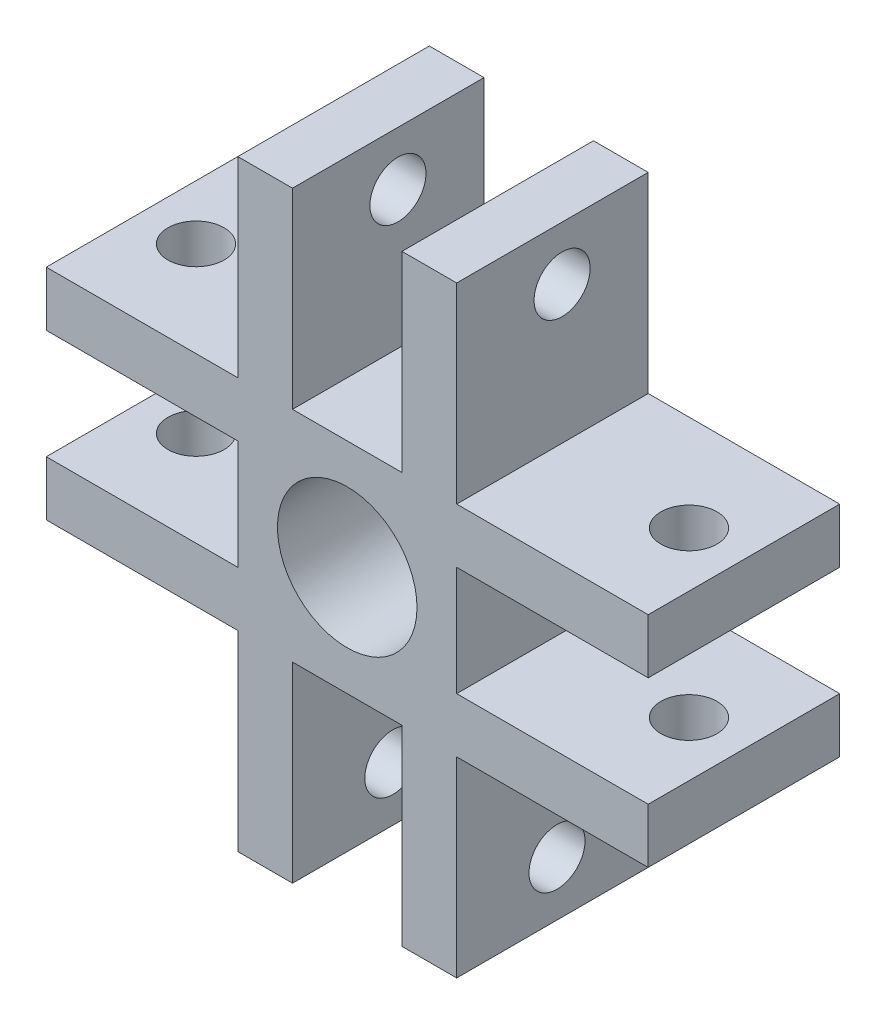
ISO-10303-21;
HEADER;
FILE_DESCRIPTION(('STEP AP214'),'2;1');
FILE_NAME('part.step','',(''),(''),'','','');
FILE_SCHEMA(('AUTOMOTIVE_DESIGN { 1 0 10303 214 1 1 1 1 }'));
ENDSEC;
DATA;
#1=APPLICATION_CONTEXT('core data for automotive mechanical design processes');
#2=APPLICATION_PROTOCOL_DEFINITION('international standard','automotive_design',2000,#1);
#3=PRODUCT_CONTEXT('',#1,'mechanical');
#4=PRODUCT('Part','Part','',(#3));
#5=PRODUCT_RELATED_PRODUCT_CATEGORY('part','',(#4));
#6=PRODUCT_DEFINITION_FORMATION('','',#4);
#7=PRODUCT_DEFINITION_CONTEXT('part definition',#1,'design');
#8=PRODUCT_DEFINITION('design','',#6,#7);
#9=PRODUCT_DEFINITION_SHAPE('','',#8);
#10=(LENGTH_UNIT() NAMED_UNIT(*) SI_UNIT(.MILLI.,.METRE.));
#11=(NAMED_UNIT(*) PLANE_ANGLE_UNIT() SI_UNIT($,.RADIAN.));
#12=(NAMED_UNIT(*) SI_UNIT($,.STERADIAN.) SOLID_ANGLE_UNIT());
#13=UNCERTAINTY_MEASURE_WITH_UNIT(LENGTH_MEASURE(1.E-05),#10,'distance_accuracy_value','');
#14=(GEOMETRIC_REPRESENTATION_CONTEXT(3) GLOBAL_UNCERTAINTY_ASSIGNED_CONTEXT((#13)) GLOBAL_UNIT_ASSIGNED_CONTEXT((#10,
#11,#12)) REPRESENTATION_CONTEXT('',''));
#15=CARTESIAN_POINT('',(0.,0.,0.));
#16=DIRECTION('',(0.,0.,1.));
#17=DIRECTION('',(1.,0.,0.));
#18=AXIS2_PLACEMENT_3D('',#15,#16,#17);
#19=CARTESIAN_POINT('',(11.,-11.,7.));
#20=DIRECTION('',(0.,0.,1.));
#21=DIRECTION('',(1.,0.,0.));
#22=AXIS2_PLACEMENT_3D('',#19,#20,#21);
#23=PLANE('',#22);
#24=CARTESIAN_POINT('',(0.,0.,7.));
#25=DIRECTION('',(0.,0.,1.));
#26=DIRECTION('',(1.,0.,0.));
#27=AXIS2_PLACEMENT_3D('',#24,#25,#26);
#28=CIRCLE('',#27,2.55);
#29=CARTESIAN_POINT('',(2.55,0.,7.));
#30=VERTEX_POINT('',#29);
#31=EDGE_CURVE('E247',#30,#30,#28,.T.);
#32=ORIENTED_EDGE('',*,*,#31,.F.);
#33=EDGE_LOOP('',(#32));
#34=FACE_BOUND('',#33,.T.);
#35=DIRECTION('',(-1.,0.,0.));
#36=VECTOR('',#35,1.);
#37=CARTESIAN_POINT('',(-0.933783745639004,-3.99999999999999,7.));
#38=LINE('',#37,#36);
#39=CARTESIAN_POINT('',(1.99999999999999,-4.00000000000001,7.));
#40=VERTEX_POINT('',#39);
#41=CARTESIAN_POINT('',(-2.00000000000001,-3.99999999999999,7.));
#42=VERTEX_POINT('',#41);
#43=EDGE_CURVE('E244',#40,#42,#38,.T.);
#44=ORIENTED_EDGE('',*,*,#43,.F.);
#45=DIRECTION('',(0.,-1.,0.));
#46=VECTOR('',#45,1.);
#47=CARTESIAN_POINT('',(1.99999999999991,-24.6504822813114,7.));
#48=LINE('',#47,#46);
#49=CARTESIAN_POINT('',(1.99999999999997,-11.,7.));
#50=VERTEX_POINT('',#49);
#51=EDGE_CURVE('E225',#40,#50,#48,.T.);
#52=ORIENTED_EDGE('',*,*,#51,.T.);
#53=DIRECTION('',(1.,0.,0.));
#54=VECTOR('',#53,1.);
#55=CARTESIAN_POINT('',(-11.,-11.,7.));
#56=LINE('',#55,#54);
#57=CARTESIAN_POINT('',(4.00000000000016,-11.,7.));
#58=VERTEX_POINT('',#57);
#59=EDGE_CURVE('E41',#50,#58,#56,.T.);
#60=ORIENTED_EDGE('',*,*,#59,.T.);
#61=DIRECTION('',(0.,-1.,0.));
#62=VECTOR('',#61,1.);
#63=CARTESIAN_POINT('',(4.00000000000016,-4.,7.));
#64=LINE('',#63,#62);
#65=CARTESIAN_POINT('',(4.00000000000016,-4.,7.));
#66=VERTEX_POINT('',#65);
#67=EDGE_CURVE('E337',#66,#58,#64,.T.);
#68=ORIENTED_EDGE('',*,*,#67,.F.);
#69=DIRECTION('',(-1.,0.,0.));
#70=VECTOR('',#69,1.);
#71=CARTESIAN_POINT('',(4.00000000000016,-4.,7.));
#72=LINE('',#71,#70);
#73=CARTESIAN_POINT('',(11.0000000000002,-4.,7.));
#74=VERTEX_POINT('',#73);
#75=EDGE_CURVE('E326',#74,#66,#72,.T.);
#76=ORIENTED_EDGE('',*,*,#75,.F.);
#77=DIRECTION('',(0.,1.,0.));
#78=VECTOR('',#77,1.);
#79=CARTESIAN_POINT('',(11.,11.,7.));
#80=LINE('',#79,#78);
#81=CARTESIAN_POINT('',(11.,-2.,7.));
#82=VERTEX_POINT('',#81);
#83=EDGE_CURVE('E408',#74,#82,#80,.T.);
#84=ORIENTED_EDGE('',*,*,#83,.T.);
#85=DIRECTION('',(1.,0.,0.));
#86=VECTOR('',#85,1.);
#87=CARTESIAN_POINT('',(-0.933783745639071,-2.,7.));
#88=LINE('',#87,#86);
#89=CARTESIAN_POINT('',(4.,-2.,7.));
#90=VERTEX_POINT('',#89);
#91=EDGE_CURVE('E57',#90,#82,#88,.T.);
#92=ORIENTED_EDGE('',*,*,#91,.F.);
#93=DIRECTION('',(0.,-1.,0.));
#94=VECTOR('',#93,1.);
#95=CARTESIAN_POINT('',(4.,-24.6504822813114,7.));
#96=LINE('',#95,#94);
#97=CARTESIAN_POINT('',(4.,2.,7.));
#98=VERTEX_POINT('',#97);
#99=EDGE_CURVE('E271',#98,#90,#96,.T.);
#100=ORIENTED_EDGE('',*,*,#99,.F.);
#101=DIRECTION('',(1.,0.,0.));
#102=VECTOR('',#101,1.);
#103=CARTESIAN_POINT('',(-0.933783745639071,2.,7.));
#104=LINE('',#103,#102);
#105=CARTESIAN_POINT('',(11.,2.,7.));
#106=VERTEX_POINT('',#105);
#107=EDGE_CURVE('E256',#98,#106,#104,.T.);
#108=ORIENTED_EDGE('',*,*,#107,.T.);
#109=CARTESIAN_POINT('',(11.,4.,7.));
#110=VERTEX_POINT('',#109);
#111=EDGE_CURVE('E412',#106,#110,#80,.T.);
#112=ORIENTED_EDGE('',*,*,#111,.T.);
#113=DIRECTION('',(1.,0.,0.));
#114=VECTOR('',#113,1.);
#115=CARTESIAN_POINT('',(4.,4.,7.));
#116=LINE('',#115,#114);
#117=CARTESIAN_POINT('',(4.,4.,7.));
#118=VERTEX_POINT('',#117);
#119=EDGE_CURVE('E374',#118,#110,#116,.T.);
#120=ORIENTED_EDGE('',*,*,#119,.F.);
#121=DIRECTION('',(0.,-1.,0.));
#122=VECTOR('',#121,1.);
#123=CARTESIAN_POINT('',(4.,11.,7.));
#124=LINE('',#123,#122);
#125=CARTESIAN_POINT('',(4.,11.,7.));
#126=VERTEX_POINT('',#125);
#127=EDGE_CURVE('E365',#126,#118,#124,.T.);
#128=ORIENTED_EDGE('',*,*,#127,.F.);
#129=DIRECTION('',(-1.,0.,0.));
#130=VECTOR('',#129,1.);
#131=CARTESIAN_POINT('',(-11.,11.,7.));
#132=LINE('',#131,#130);
#133=CARTESIAN_POINT('',(2.00000000000008,11.,7.));
#134=VERTEX_POINT('',#133);
#135=EDGE_CURVE('E413',#126,#134,#132,.T.);
#136=ORIENTED_EDGE('',*,*,#135,.T.);
#137=DIRECTION('',(0.,1.,0.));
#138=VECTOR('',#137,1.);
#139=CARTESIAN_POINT('',(1.99999999999974,-24.6504822813114,7.));
#140=LINE('',#139,#138);
#141=CARTESIAN_POINT('',(2.00000000000004,3.99999999999998,7.));
#142=VERTEX_POINT('',#141);
#143=EDGE_CURVE('E286',#142,#134,#140,.T.);
#144=ORIENTED_EDGE('',*,*,#143,.F.);
#145=DIRECTION('',(1.,0.,0.));
#146=VECTOR('',#145,1.);
#147=CARTESIAN_POINT('',(-0.933783745638779,4.00000000000001,7.));
#148=LINE('',#147,#146);
#149=CARTESIAN_POINT('',(-1.99999999999996,4.00000000000002,7.));
#150=VERTEX_POINT('',#149);
#151=EDGE_CURVE('E295',#150,#142,#148,.T.);
#152=ORIENTED_EDGE('',*,*,#151,.F.);
#153=DIRECTION('',(0.,1.,0.));
#154=VECTOR('',#153,1.);
#155=CARTESIAN_POINT('',(-2.00000000000026,-24.6504822813114,7.));
#156=LINE('',#155,#154);
#157=CARTESIAN_POINT('',(-1.99999999999992,11.,7.));
#158=VERTEX_POINT('',#157);
#159=EDGE_CURVE('E277',#150,#158,#156,.T.);
#160=ORIENTED_EDGE('',*,*,#159,.T.);
#161=CARTESIAN_POINT('',(-4.,11.,7.));
#162=VERTEX_POINT('',#161);
#163=EDGE_CURVE('E411',#158,#162,#132,.T.);
#164=ORIENTED_EDGE('',*,*,#163,.T.);
#165=DIRECTION('',(0.,1.,0.));
#166=VECTOR('',#165,1.);
#167=CARTESIAN_POINT('',(-4.,11.,7.));
#168=LINE('',#167,#166);
#169=CARTESIAN_POINT('',(-4.,4.,7.));
#170=VERTEX_POINT('',#169);
#171=EDGE_CURVE('E393',#170,#162,#168,.T.);
#172=ORIENTED_EDGE('',*,*,#171,.F.);
#173=DIRECTION('',(1.,0.,0.));
#174=VECTOR('',#173,1.);
#175=CARTESIAN_POINT('',(-11.,4.,7.));
#176=LINE('',#175,#174);
#177=CARTESIAN_POINT('',(-11.,4.,7.));
#178=VERTEX_POINT('',#177);
#179=EDGE_CURVE('E385',#178,#170,#176,.T.);
#180=ORIENTED_EDGE('',*,*,#179,.F.);
#181=DIRECTION('',(0.,-1.,0.));
#182=VECTOR('',#181,1.);
#183=CARTESIAN_POINT('',(-11.,11.,7.));
#184=LINE('',#183,#182);
#185=CARTESIAN_POINT('',(-11.,2.00000000000005,7.));
#186=VERTEX_POINT('',#185);
#187=EDGE_CURVE('E417',#178,#186,#184,.T.);
#188=ORIENTED_EDGE('',*,*,#187,.T.);
#189=DIRECTION('',(-1.,0.,0.));
#190=VECTOR('',#189,1.);
#191=CARTESIAN_POINT('',(-0.933783745638885,2.00000000000001,7.));
#192=LINE('',#191,#190);
#193=CARTESIAN_POINT('',(-3.99999999999999,2.00000000000003,7.));
#194=VERTEX_POINT('',#193);
#195=EDGE_CURVE('E311',#194,#186,#192,.T.);
#196=ORIENTED_EDGE('',*,*,#195,.F.);
#197=DIRECTION('',(0.,1.,0.));
#198=VECTOR('',#197,1.);
#199=CARTESIAN_POINT('',(-4.00000000000017,-24.6504822813114,7.));
#200=LINE('',#199,#198);
#201=CARTESIAN_POINT('',(-4.00000000000001,-1.99999999999997,7.));
#202=VERTEX_POINT('',#201);
#203=EDGE_CURVE('E320',#202,#194,#200,.T.);
#204=ORIENTED_EDGE('',*,*,#203,.F.);
#205=DIRECTION('',(-1.,0.,0.));
#206=VECTOR('',#205,1.);
#207=CARTESIAN_POINT('',(-0.933783745638913,-1.99999999999999,7.));
#208=LINE('',#207,#206);
#209=CARTESIAN_POINT('',(-11.,-1.99999999999995,7.));
#210=VERTEX_POINT('',#209);
#211=EDGE_CURVE('E301',#202,#210,#208,.T.);
#212=ORIENTED_EDGE('',*,*,#211,.T.);
#213=CARTESIAN_POINT('',(-10.9999999999998,-4.,7.));
#214=VERTEX_POINT('',#213);
#215=EDGE_CURVE('E416',#210,#214,#184,.T.);
#216=ORIENTED_EDGE('',*,*,#215,.T.);
#217=DIRECTION('',(-1.,0.,0.));
#218=VECTOR('',#217,1.);
#219=CARTESIAN_POINT('',(-10.9999999999998,-4.,7.));
#220=LINE('',#219,#218);
#221=CARTESIAN_POINT('',(-3.99999999999984,-4.,7.));
#222=VERTEX_POINT('',#221);
#223=EDGE_CURVE('E346',#222,#214,#220,.T.);
#224=ORIENTED_EDGE('',*,*,#223,.F.);
#225=DIRECTION('',(0.,1.,0.));
#226=VECTOR('',#225,1.);
#227=CARTESIAN_POINT('',(-3.99999999999984,-4.,7.));
#228=LINE('',#227,#226);
#229=CARTESIAN_POINT('',(-3.99999999999984,-11.,7.));
#230=VERTEX_POINT('',#229);
#231=EDGE_CURVE('E355',#230,#222,#228,.T.);
#232=ORIENTED_EDGE('',*,*,#231,.F.);
#233=CARTESIAN_POINT('',(-2.00000000000003,-11.,7.));
#234=VERTEX_POINT('',#233);
#235=EDGE_CURVE('E11',#230,#234,#56,.T.);
#236=ORIENTED_EDGE('',*,*,#235,.T.);
#237=DIRECTION('',(0.,-1.,0.));
#238=VECTOR('',#237,1.);
#239=CARTESIAN_POINT('',(-2.00000000000009,-24.6504822813114,7.));
#240=LINE('',#239,#238);
#241=EDGE_CURVE('E49',#42,#234,#240,.T.);
#242=ORIENTED_EDGE('',*,*,#241,.F.);
#243=EDGE_LOOP('',(#44,#52,#60,#68,#76,#84,#92,#100,#108,#112,#120,#128,#136,#144,#152,#160,
#164,#172,#180,#188,#196,#204,#212,#216,#224,#232,#236,#242));
#244=FACE_BOUND('',#243,.T.);
#245=ADVANCED_FACE('F32',(#34,#244),#23,.T.);
#246=CARTESIAN_POINT('',(11.,-11.,0.));
#247=DIRECTION('',(0.,0.,1.));
#248=DIRECTION('',(1.,0.,0.));
#249=AXIS2_PLACEMENT_3D('',#246,#247,#248);
#250=PLANE('',#249);
#251=CARTESIAN_POINT('',(0.,0.,0.));
#252=DIRECTION('',(0.,0.,1.));
#253=DIRECTION('',(1.,0.,0.));
#254=AXIS2_PLACEMENT_3D('',#251,#252,#253);
#255=CIRCLE('',#254,2.55);
#256=CARTESIAN_POINT('',(2.55,0.,0.));
#257=VERTEX_POINT('',#256);
#258=EDGE_CURVE('E252',#257,#257,#255,.T.);
#259=ORIENTED_EDGE('',*,*,#258,.T.);
#260=EDGE_LOOP('',(#259));
#261=FACE_BOUND('',#260,.T.);
#262=DIRECTION('',(0.,-1.,0.));
#263=VECTOR('',#262,1.);
#264=CARTESIAN_POINT('',(1.99999999999991,-24.6504822813114,0.));
#265=LINE('',#264,#263);
#266=CARTESIAN_POINT('',(1.99999999999999,-4.00000000000001,0.));
#267=VERTEX_POINT('',#266);
#268=CARTESIAN_POINT('',(1.99999999999997,-11.,0.));
#269=VERTEX_POINT('',#268);
#270=EDGE_CURVE('E222',#267,#269,#265,.T.);
#271=ORIENTED_EDGE('',*,*,#270,.F.);
#272=DIRECTION('',(-1.,0.,0.));
#273=VECTOR('',#272,1.);
#274=CARTESIAN_POINT('',(-0.933783745639004,-3.99999999999999,0.));
#275=LINE('',#274,#273);
#276=CARTESIAN_POINT('',(-2.00000000000001,-3.99999999999999,0.));
#277=VERTEX_POINT('',#276);
#278=EDGE_CURVE('E233',#267,#277,#275,.T.);
#279=ORIENTED_EDGE('',*,*,#278,.T.);
#280=DIRECTION('',(0.,-1.,0.));
#281=VECTOR('',#280,1.);
#282=CARTESIAN_POINT('',(-2.00000000000009,-24.6504822813114,0.));
#283=LINE('',#282,#281);
#284=CARTESIAN_POINT('',(-2.00000000000003,-11.,0.));
#285=VERTEX_POINT('',#284);
#286=EDGE_CURVE('E230',#277,#285,#283,.T.);
#287=ORIENTED_EDGE('',*,*,#286,.T.);
#288=DIRECTION('',(1.,0.,0.));
#289=VECTOR('',#288,1.);
#290=CARTESIAN_POINT('',(-11.,-11.,0.));
#291=LINE('',#290,#289);
#292=CARTESIAN_POINT('',(-3.99999999999984,-11.,0.));
#293=VERTEX_POINT('',#292);
#294=EDGE_CURVE('E431',#293,#285,#291,.T.);
#295=ORIENTED_EDGE('',*,*,#294,.F.);
#296=DIRECTION('',(0.,1.,0.));
#297=VECTOR('',#296,1.);
#298=CARTESIAN_POINT('',(-3.99999999999984,-4.,0.));
#299=LINE('',#298,#297);
#300=CARTESIAN_POINT('',(-3.99999999999984,-4.,0.));
#301=VERTEX_POINT('',#300);
#302=EDGE_CURVE('E354',#293,#301,#299,.T.);
#303=ORIENTED_EDGE('',*,*,#302,.T.);
#304=DIRECTION('',(-1.,0.,0.));
#305=VECTOR('',#304,1.);
#306=CARTESIAN_POINT('',(-10.9999999999998,-4.,0.));
#307=LINE('',#306,#305);
#308=CARTESIAN_POINT('',(-10.9999999999998,-4.,0.));
#309=VERTEX_POINT('',#308);
#310=EDGE_CURVE('E351',#301,#309,#307,.T.);
#311=ORIENTED_EDGE('',*,*,#310,.T.);
#312=DIRECTION('',(0.,-1.,0.));
#313=VECTOR('',#312,1.);
#314=CARTESIAN_POINT('',(-11.,11.,0.));
#315=LINE('',#314,#313);
#316=CARTESIAN_POINT('',(-11.,-1.99999999999995,0.));
#317=VERTEX_POINT('',#316);
#318=EDGE_CURVE('E427',#317,#309,#315,.T.);
#319=ORIENTED_EDGE('',*,*,#318,.F.);
#320=DIRECTION('',(-1.,0.,0.));
#321=VECTOR('',#320,1.);
#322=CARTESIAN_POINT('',(-0.933783745638913,-1.99999999999999,0.));
#323=LINE('',#322,#321);
#324=CARTESIAN_POINT('',(-4.00000000000001,-1.99999999999997,0.));
#325=VERTEX_POINT('',#324);
#326=EDGE_CURVE('E308',#325,#317,#323,.T.);
#327=ORIENTED_EDGE('',*,*,#326,.F.);
#328=DIRECTION('',(0.,1.,0.));
#329=VECTOR('',#328,1.);
#330=CARTESIAN_POINT('',(-4.00000000000017,-24.6504822813114,0.));
#331=LINE('',#330,#329);
#332=CARTESIAN_POINT('',(-3.99999999999999,2.00000000000003,0.));
#333=VERTEX_POINT('',#332);
#334=EDGE_CURVE('E310',#325,#333,#331,.T.);
#335=ORIENTED_EDGE('',*,*,#334,.T.);
#336=DIRECTION('',(-1.,0.,0.));
#337=VECTOR('',#336,1.);
#338=CARTESIAN_POINT('',(-0.933783745638885,2.00000000000001,0.));
#339=LINE('',#338,#337);
#340=CARTESIAN_POINT('',(-11.,2.00000000000005,0.));
#341=VERTEX_POINT('',#340);
#342=EDGE_CURVE('E314',#333,#341,#339,.T.);
#343=ORIENTED_EDGE('',*,*,#342,.T.);
#344=CARTESIAN_POINT('',(-11.,4.,0.));
#345=VERTEX_POINT('',#344);
#346=EDGE_CURVE('E428',#345,#341,#315,.T.);
#347=ORIENTED_EDGE('',*,*,#346,.F.);
#348=DIRECTION('',(1.,0.,0.));
#349=VECTOR('',#348,1.);
#350=CARTESIAN_POINT('',(-11.,4.,0.));
#351=LINE('',#350,#349);
#352=CARTESIAN_POINT('',(-4.,4.,0.));
#353=VERTEX_POINT('',#352);
#354=EDGE_CURVE('E389',#345,#353,#351,.T.);
#355=ORIENTED_EDGE('',*,*,#354,.T.);
#356=DIRECTION('',(0.,1.,0.));
#357=VECTOR('',#356,1.);
#358=CARTESIAN_POINT('',(-4.,11.,0.));
#359=LINE('',#358,#357);
#360=CARTESIAN_POINT('',(-4.,11.,0.));
#361=VERTEX_POINT('',#360);
#362=EDGE_CURVE('E392',#353,#361,#359,.T.);
#363=ORIENTED_EDGE('',*,*,#362,.T.);
#364=DIRECTION('',(-1.,0.,0.));
#365=VECTOR('',#364,1.);
#366=CARTESIAN_POINT('',(-11.,11.,0.));
#367=LINE('',#366,#365);
#368=CARTESIAN_POINT('',(-1.99999999999992,11.,0.));
#369=VERTEX_POINT('',#368);
#370=EDGE_CURVE('E423',#369,#361,#367,.T.);
#371=ORIENTED_EDGE('',*,*,#370,.F.);
#372=DIRECTION('',(0.,1.,0.));
#373=VECTOR('',#372,1.);
#374=CARTESIAN_POINT('',(-2.00000000000026,-24.6504822813114,0.));
#375=LINE('',#374,#373);
#376=CARTESIAN_POINT('',(-1.99999999999996,4.00000000000002,0.));
#377=VERTEX_POINT('',#376);
#378=EDGE_CURVE('E283',#377,#369,#375,.T.);
#379=ORIENTED_EDGE('',*,*,#378,.F.);
#380=DIRECTION('',(1.,0.,0.));
#381=VECTOR('',#380,1.);
#382=CARTESIAN_POINT('',(-0.933783745638779,4.00000000000001,0.));
#383=LINE('',#382,#381);
#384=CARTESIAN_POINT('',(2.00000000000004,3.99999999999998,0.));
#385=VERTEX_POINT('',#384);
#386=EDGE_CURVE('E285',#377,#385,#383,.T.);
#387=ORIENTED_EDGE('',*,*,#386,.T.);
#388=DIRECTION('',(0.,1.,0.));
#389=VECTOR('',#388,1.);
#390=CARTESIAN_POINT('',(1.99999999999974,-24.6504822813114,0.));
#391=LINE('',#390,#389);
#392=CARTESIAN_POINT('',(2.00000000000008,11.,0.));
#393=VERTEX_POINT('',#392);
#394=EDGE_CURVE('E289',#385,#393,#391,.T.);
#395=ORIENTED_EDGE('',*,*,#394,.T.);
#396=CARTESIAN_POINT('',(4.,11.,0.));
#397=VERTEX_POINT('',#396);
#398=EDGE_CURVE('E424',#397,#393,#367,.T.);
#399=ORIENTED_EDGE('',*,*,#398,.F.);
#400=DIRECTION('',(0.,-1.,0.));
#401=VECTOR('',#400,1.);
#402=CARTESIAN_POINT('',(4.,11.,0.));
#403=LINE('',#402,#401);
#404=CARTESIAN_POINT('',(4.,4.,0.));
#405=VERTEX_POINT('',#404);
#406=EDGE_CURVE('E370',#397,#405,#403,.T.);
#407=ORIENTED_EDGE('',*,*,#406,.T.);
#408=DIRECTION('',(1.,0.,0.));
#409=VECTOR('',#408,1.);
#410=CARTESIAN_POINT('',(4.,4.,0.));
#411=LINE('',#410,#409);
#412=CARTESIAN_POINT('',(11.,4.,0.));
#413=VERTEX_POINT('',#412);
#414=EDGE_CURVE('E373',#405,#413,#411,.T.);
#415=ORIENTED_EDGE('',*,*,#414,.T.);
#416=DIRECTION('',(0.,1.,0.));
#417=VECTOR('',#416,1.);
#418=CARTESIAN_POINT('',(11.,11.,0.));
#419=LINE('',#418,#417);
#420=CARTESIAN_POINT('',(11.,2.,0.));
#421=VERTEX_POINT('',#420);
#422=EDGE_CURVE('E404',#421,#413,#419,.T.);
#423=ORIENTED_EDGE('',*,*,#422,.F.);
#424=DIRECTION('',(1.,0.,0.));
#425=VECTOR('',#424,1.);
#426=CARTESIAN_POINT('',(-0.933783745639071,2.,0.));
#427=LINE('',#426,#425);
#428=CARTESIAN_POINT('',(4.,2.,0.));
#429=VERTEX_POINT('',#428);
#430=EDGE_CURVE('E260',#429,#421,#427,.T.);
#431=ORIENTED_EDGE('',*,*,#430,.F.);
#432=DIRECTION('',(0.,-1.,0.));
#433=VECTOR('',#432,1.);
#434=CARTESIAN_POINT('',(4.,-24.6504822813114,0.));
#435=LINE('',#434,#433);
#436=CARTESIAN_POINT('',(4.,-2.,0.));
#437=VERTEX_POINT('',#436);
#438=EDGE_CURVE('E262',#429,#437,#435,.T.);
#439=ORIENTED_EDGE('',*,*,#438,.T.);
#440=DIRECTION('',(1.,0.,0.));
#441=VECTOR('',#440,1.);
#442=CARTESIAN_POINT('',(-0.933783745639071,-2.,0.));
#443=LINE('',#442,#441);
#444=CARTESIAN_POINT('',(11.,-2.,0.));
#445=VERTEX_POINT('',#444);
#446=EDGE_CURVE('E265',#437,#445,#443,.T.);
#447=ORIENTED_EDGE('',*,*,#446,.T.);
#448=CARTESIAN_POINT('',(11.0000000000002,-4.,0.));
#449=VERTEX_POINT('',#448);
#450=EDGE_CURVE('E420',#449,#445,#419,.T.);
#451=ORIENTED_EDGE('',*,*,#450,.F.);
#452=DIRECTION('',(-1.,0.,0.));
#453=VECTOR('',#452,1.);
#454=CARTESIAN_POINT('',(4.00000000000016,-4.,0.));
#455=LINE('',#454,#453);
#456=CARTESIAN_POINT('',(4.00000000000016,-4.,0.));
#457=VERTEX_POINT('',#456);
#458=EDGE_CURVE('E333',#449,#457,#455,.T.);
#459=ORIENTED_EDGE('',*,*,#458,.T.);
#460=DIRECTION('',(0.,-1.,0.));
#461=VECTOR('',#460,1.);
#462=CARTESIAN_POINT('',(4.00000000000016,-4.,0.));
#463=LINE('',#462,#461);
#464=CARTESIAN_POINT('',(4.00000000000016,-11.,0.));
#465=VERTEX_POINT('',#464);
#466=EDGE_CURVE('E336',#457,#465,#463,.T.);
#467=ORIENTED_EDGE('',*,*,#466,.T.);
#468=EDGE_CURVE('E242',#269,#465,#291,.T.);
#469=ORIENTED_EDGE('',*,*,#468,.F.);
#470=EDGE_LOOP('',(#271,#279,#287,#295,#303,#311,#319,#327,#335,#343,#347,#355,#363,#371,#379,
#387,#395,#399,#407,#415,#423,#431,#439,#447,#451,#459,#467,#469));
#471=FACE_BOUND('',#470,.T.);
#472=ADVANCED_FACE('F240',(#261,#471),#250,.F.);
#473=CARTESIAN_POINT('',(-11.,-11.,7.));
#474=DIRECTION('',(0.,1.,0.));
#475=DIRECTION('',(0.,0.,1.));
#476=AXIS2_PLACEMENT_3D('',#473,#474,#475);
#477=PLANE('',#476);
#478=DIRECTION('',(0.,0.,1.));
#479=VECTOR('',#478,1.);
#480=CARTESIAN_POINT('',(1.99999999999997,-11.,0.));
#481=LINE('',#480,#479);
#482=EDGE_CURVE('E254',#269,#50,#481,.T.);
#483=ORIENTED_EDGE('',*,*,#482,.F.);
#484=ORIENTED_EDGE('',*,*,#468,.T.);
#485=DIRECTION('',(0.,0.,1.));
#486=VECTOR('',#485,1.);
#487=CARTESIAN_POINT('',(4.00000000000016,-11.,0.));
#488=LINE('',#487,#486);
#489=EDGE_CURVE('E347',#465,#58,#488,.T.);
#490=ORIENTED_EDGE('',*,*,#489,.T.);
#491=ORIENTED_EDGE('',*,*,#59,.F.);
#492=EDGE_LOOP('',(#483,#484,#490,#491));
#493=FACE_BOUND('',#492,.T.);
#494=ADVANCED_FACE('F592',(#493),#477,.F.);
#495=CARTESIAN_POINT('',(11.,11.,7.));
#496=DIRECTION('',(-1.,0.,0.));
#497=DIRECTION('',(0.,-1.,0.));
#498=AXIS2_PLACEMENT_3D('',#495,#496,#497);
#499=PLANE('',#498);
#500=DIRECTION('',(0.,0.,1.));
#501=VECTOR('',#500,1.);
#502=CARTESIAN_POINT('',(11.,2.,0.));
#503=LINE('',#502,#501);
#504=EDGE_CURVE('E275',#421,#106,#503,.T.);
#505=ORIENTED_EDGE('',*,*,#504,.F.);
#506=ORIENTED_EDGE('',*,*,#422,.T.);
#507=DIRECTION('',(0.,0.,1.));
#508=VECTOR('',#507,1.);
#509=CARTESIAN_POINT('',(11.,4.,0.));
#510=LINE('',#509,#508);
#511=EDGE_CURVE('E382',#413,#110,#510,.T.);
#512=ORIENTED_EDGE('',*,*,#511,.T.);
#513=ORIENTED_EDGE('',*,*,#111,.F.);
#514=EDGE_LOOP('',(#505,#506,#512,#513));
#515=FACE_BOUND('',#514,.T.);
#516=ADVANCED_FACE('F567',(#515),#499,.F.);
#517=CARTESIAN_POINT('',(-11.,11.,7.));
#518=DIRECTION('',(0.,-1.,0.));
#519=DIRECTION('',(0.,0.,-1.));
#520=AXIS2_PLACEMENT_3D('',#517,#518,#519);
#521=PLANE('',#520);
#522=DIRECTION('',(0.,0.,1.));
#523=VECTOR('',#522,1.);
#524=CARTESIAN_POINT('',(-1.99999999999992,11.,0.));
#525=LINE('',#524,#523);
#526=EDGE_CURVE('E299',#369,#158,#525,.T.);
#527=ORIENTED_EDGE('',*,*,#526,.F.);
#528=ORIENTED_EDGE('',*,*,#370,.T.);
#529=DIRECTION('',(0.,0.,1.));
#530=VECTOR('',#529,1.);
#531=CARTESIAN_POINT('',(-4.,11.,0.));
#532=LINE('',#531,#530);
#533=EDGE_CURVE('E401',#361,#162,#532,.T.);
#534=ORIENTED_EDGE('',*,*,#533,.T.);
#535=ORIENTED_EDGE('',*,*,#163,.F.);
#536=EDGE_LOOP('',(#527,#528,#534,#535));
#537=FACE_BOUND('',#536,.T.);
#538=ADVANCED_FACE('F537',(#537),#521,.F.);
#539=CARTESIAN_POINT('',(-11.,11.,7.));
#540=DIRECTION('',(1.,0.,0.));
#541=DIRECTION('',(0.,1.,0.));
#542=AXIS2_PLACEMENT_3D('',#539,#540,#541);
#543=PLANE('',#542);
#544=DIRECTION('',(0.,0.,1.));
#545=VECTOR('',#544,1.);
#546=CARTESIAN_POINT('',(-11.,-1.99999999999995,0.));
#547=LINE('',#546,#545);
#548=EDGE_CURVE('E324',#317,#210,#547,.T.);
#549=ORIENTED_EDGE('',*,*,#548,.F.);
#550=ORIENTED_EDGE('',*,*,#318,.T.);
#551=DIRECTION('',(0.,0.,1.));
#552=VECTOR('',#551,1.);
#553=CARTESIAN_POINT('',(-10.9999999999998,-4.,0.));
#554=LINE('',#553,#552);
#555=EDGE_CURVE('E358',#309,#214,#554,.T.);
#556=ORIENTED_EDGE('',*,*,#555,.T.);
#557=ORIENTED_EDGE('',*,*,#215,.F.);
#558=EDGE_LOOP('',(#549,#550,#556,#557));
#559=FACE_BOUND('',#558,.T.);
#560=ADVANCED_FACE('F508',(#559),#543,.F.);
#561=ORIENTED_EDGE('',*,*,#450,.T.);
#562=DIRECTION('',(0.,0.,1.));
#563=VECTOR('',#562,1.);
#564=CARTESIAN_POINT('',(11.,-2.,0.));
#565=LINE('',#564,#563);
#566=EDGE_CURVE('E278',#445,#82,#565,.T.);
#567=ORIENTED_EDGE('',*,*,#566,.T.);
#568=ORIENTED_EDGE('',*,*,#83,.F.);
#569=DIRECTION('',(0.,0.,1.));
#570=VECTOR('',#569,1.);
#571=CARTESIAN_POINT('',(11.0000000000002,-4.,0.));
#572=LINE('',#571,#570);
#573=EDGE_CURVE('E344',#449,#74,#572,.T.);
#574=ORIENTED_EDGE('',*,*,#573,.F.);
#575=EDGE_LOOP('',(#561,#567,#568,#574));
#576=FACE_BOUND('',#575,.T.);
#577=ADVANCED_FACE('F34',(#576),#499,.F.);
#578=ORIENTED_EDGE('',*,*,#398,.T.);
#579=DIRECTION('',(0.,0.,1.));
#580=VECTOR('',#579,1.);
#581=CARTESIAN_POINT('',(2.00000000000008,11.,0.));
#582=LINE('',#581,#580);
#583=EDGE_CURVE('E302',#393,#134,#582,.T.);
#584=ORIENTED_EDGE('',*,*,#583,.T.);
#585=ORIENTED_EDGE('',*,*,#135,.F.);
#586=DIRECTION('',(0.,0.,1.));
#587=VECTOR('',#586,1.);
#588=CARTESIAN_POINT('',(4.,11.,0.));
#589=LINE('',#588,#587);
#590=EDGE_CURVE('E377',#397,#126,#589,.T.);
#591=ORIENTED_EDGE('',*,*,#590,.F.);
#592=EDGE_LOOP('',(#578,#584,#585,#591));
#593=FACE_BOUND('',#592,.T.);
#594=ADVANCED_FACE('F554',(#593),#521,.F.);
#595=ORIENTED_EDGE('',*,*,#346,.T.);
#596=DIRECTION('',(0.,0.,1.));
#597=VECTOR('',#596,1.);
#598=CARTESIAN_POINT('',(-11.,2.00000000000005,0.));
#599=LINE('',#598,#597);
#600=EDGE_CURVE('E327',#341,#186,#599,.T.);
#601=ORIENTED_EDGE('',*,*,#600,.T.);
#602=ORIENTED_EDGE('',*,*,#187,.F.);
#603=DIRECTION('',(0.,0.,1.));
#604=VECTOR('',#603,1.);
#605=CARTESIAN_POINT('',(-11.,4.,0.));
#606=LINE('',#605,#604);
#607=EDGE_CURVE('E396',#345,#178,#606,.T.);
#608=ORIENTED_EDGE('',*,*,#607,.F.);
#609=EDGE_LOOP('',(#595,#601,#602,#608));
#610=FACE_BOUND('',#609,.T.);
#611=ADVANCED_FACE('F524',(#610),#543,.F.);
#612=ORIENTED_EDGE('',*,*,#294,.T.);
#613=DIRECTION('',(0.,0.,1.));
#614=VECTOR('',#613,1.);
#615=CARTESIAN_POINT('',(-2.00000000000003,-11.,0.));
#616=LINE('',#615,#614);
#617=EDGE_CURVE('E257',#285,#234,#616,.T.);
#618=ORIENTED_EDGE('',*,*,#617,.T.);
#619=ORIENTED_EDGE('',*,*,#235,.F.);
#620=DIRECTION('',(0.,0.,1.));
#621=VECTOR('',#620,1.);
#622=CARTESIAN_POINT('',(-3.99999999999984,-11.,0.));
#623=LINE('',#622,#621);
#624=EDGE_CURVE('E366',#293,#230,#623,.T.);
#625=ORIENTED_EDGE('',*,*,#624,.F.);
#626=EDGE_LOOP('',(#612,#618,#619,#625));
#627=FACE_BOUND('',#626,.T.);
#628=ADVANCED_FACE('F495',(#627),#477,.F.);
#629=CARTESIAN_POINT('',(-4.,11.,0.));
#630=DIRECTION('',(1.,0.,0.));
#631=DIRECTION('',(0.,0.,-1.));
#632=AXIS2_PLACEMENT_3D('',#629,#630,#631);
#633=PLANE('',#632);
#634=CARTESIAN_POINT('',(-4.,9.0313609981526,3.14721043041883));
#635=DIRECTION('',(1.,0.,0.));
#636=DIRECTION('',(0.,0.,-1.));
#637=AXIS2_PLACEMENT_3D('',#634,#635,#636);
#638=CIRCLE('',#637,1.025);
#639=CARTESIAN_POINT('',(-4.,9.0313609981526,2.12221043041883));
#640=VERTEX_POINT('',#639);
#641=EDGE_CURVE('E476',#640,#640,#638,.T.);
#642=ORIENTED_EDGE('',*,*,#641,.T.);
#643=EDGE_LOOP('',(#642));
#644=FACE_BOUND('',#643,.T.);
#645=ORIENTED_EDGE('',*,*,#171,.T.);
#646=ORIENTED_EDGE('',*,*,#533,.F.);
#647=ORIENTED_EDGE('',*,*,#362,.F.);
#648=DIRECTION('',(0.,0.,1.));
#649=VECTOR('',#648,1.);
#650=CARTESIAN_POINT('',(-4.,4.,0.));
#651=LINE('',#650,#649);
#652=EDGE_CURVE('E405',#353,#170,#651,.T.);
#653=ORIENTED_EDGE('',*,*,#652,.T.);
#654=EDGE_LOOP('',(#645,#646,#647,#653));
#655=FACE_BOUND('',#654,.T.);
#656=ADVANCED_FACE('F534',(#644,#655),#633,.F.);
#657=CARTESIAN_POINT('',(-11.,4.,0.));
#658=DIRECTION('',(0.,-1.,0.));
#659=DIRECTION('',(0.,0.,-1.));
#660=AXIS2_PLACEMENT_3D('',#657,#658,#659);
#661=PLANE('',#660);
#662=CARTESIAN_POINT('',(-8.99999999999984,4.,3.5269766343049));
#663=DIRECTION('',(0.,-1.,0.));
#664=DIRECTION('',(0.,0.,-1.));
#665=AXIS2_PLACEMENT_3D('',#662,#663,#664);
#666=CIRCLE('',#665,1.025);
#667=CARTESIAN_POINT('',(-8.99999999999984,4.,2.5019766343049));
#668=VERTEX_POINT('',#667);
#669=EDGE_CURVE('E470',#668,#668,#666,.T.);
#670=ORIENTED_EDGE('',*,*,#669,.T.);
#671=EDGE_LOOP('',(#670));
#672=FACE_BOUND('',#671,.T.);
#673=ORIENTED_EDGE('',*,*,#179,.T.);
#674=ORIENTED_EDGE('',*,*,#652,.F.);
#675=ORIENTED_EDGE('',*,*,#354,.F.);
#676=ORIENTED_EDGE('',*,*,#607,.T.);
#677=EDGE_LOOP('',(#673,#674,#675,#676));
#678=FACE_BOUND('',#677,.T.);
#679=ADVANCED_FACE('F528',(#672,#678),#661,.F.);
#680=CARTESIAN_POINT('',(4.,4.,0.));
#681=DIRECTION('',(0.,-1.,0.));
#682=DIRECTION('',(0.,0.,-1.));
#683=AXIS2_PLACEMENT_3D('',#680,#681,#682);
#684=PLANE('',#683);
#685=CARTESIAN_POINT('',(9.,4.,3.51045164111952));
#686=DIRECTION('',(0.,1.,0.));
#687=DIRECTION('',(0.,0.,1.));
#688=AXIS2_PLACEMENT_3D('',#685,#686,#687);
#689=CIRCLE('',#688,1.025);
#690=CARTESIAN_POINT('',(9.,4.,4.53545164111952));
#691=VERTEX_POINT('',#690);
#692=EDGE_CURVE('E890',#691,#691,#689,.T.);
#693=ORIENTED_EDGE('',*,*,#692,.F.);
#694=EDGE_LOOP('',(#693));
#695=FACE_BOUND('',#694,.T.);
#696=ORIENTED_EDGE('',*,*,#119,.T.);
#697=ORIENTED_EDGE('',*,*,#511,.F.);
#698=ORIENTED_EDGE('',*,*,#414,.F.);
#699=DIRECTION('',(0.,0.,1.));
#700=VECTOR('',#699,1.);
#701=CARTESIAN_POINT('',(4.,4.,0.));
#702=LINE('',#701,#700);
#703=EDGE_CURVE('E386',#405,#118,#702,.T.);
#704=ORIENTED_EDGE('',*,*,#703,.T.);
#705=EDGE_LOOP('',(#696,#697,#698,#704));
#706=FACE_BOUND('',#705,.T.);
#707=ADVANCED_FACE('F564',(#695,#706),#684,.F.);
#708=CARTESIAN_POINT('',(4.,11.,0.));
#709=DIRECTION('',(-1.,0.,0.));
#710=DIRECTION('',(0.,-1.,0.));
#711=AXIS2_PLACEMENT_3D('',#708,#709,#710);
#712=PLANE('',#711);
#713=CARTESIAN_POINT('',(4.,9.0313609981526,3.14721043041883));
#714=DIRECTION('',(1.,0.,0.));
#715=DIRECTION('',(0.,1.,0.));
#716=AXIS2_PLACEMENT_3D('',#713,#714,#715);
#717=CIRCLE('',#716,1.025);
#718=CARTESIAN_POINT('',(4.,10.0563609981526,3.14721043041883));
#719=VERTEX_POINT('',#718);
#720=EDGE_CURVE('E440',#719,#719,#717,.T.);
#721=ORIENTED_EDGE('',*,*,#720,.F.);
#722=EDGE_LOOP('',(#721));
#723=FACE_BOUND('',#722,.T.);
#724=ORIENTED_EDGE('',*,*,#127,.T.);
#725=ORIENTED_EDGE('',*,*,#703,.F.);
#726=ORIENTED_EDGE('',*,*,#406,.F.);
#727=ORIENTED_EDGE('',*,*,#590,.T.);
#728=EDGE_LOOP('',(#724,#725,#726,#727));
#729=FACE_BOUND('',#728,.T.);
#730=ADVANCED_FACE('F558',(#723,#729),#712,.F.);
#731=CARTESIAN_POINT('',(-10.9999999999998,-4.,0.));
#732=DIRECTION('',(0.,1.,0.));
#733=DIRECTION('',(0.,0.,1.));
#734=AXIS2_PLACEMENT_3D('',#731,#732,#733);
#735=PLANE('',#734);
#736=CARTESIAN_POINT('',(-8.99999999999984,-4.,3.5269766343049));
#737=DIRECTION('',(0.,-1.,0.));
#738=DIRECTION('',(0.,0.,-1.));
#739=AXIS2_PLACEMENT_3D('',#736,#737,#738);
#740=CIRCLE('',#739,1.025);
#741=CARTESIAN_POINT('',(-8.99999999999984,-4.,2.5019766343049));
#742=VERTEX_POINT('',#741);
#743=EDGE_CURVE('E444',#742,#742,#740,.T.);
#744=ORIENTED_EDGE('',*,*,#743,.F.);
#745=EDGE_LOOP('',(#744));
#746=FACE_BOUND('',#745,.T.);
#747=ORIENTED_EDGE('',*,*,#223,.T.);
#748=ORIENTED_EDGE('',*,*,#555,.F.);
#749=ORIENTED_EDGE('',*,*,#310,.F.);
#750=DIRECTION('',(0.,0.,1.));
#751=VECTOR('',#750,1.);
#752=CARTESIAN_POINT('',(-3.99999999999984,-4.,0.));
#753=LINE('',#752,#751);
#754=EDGE_CURVE('E363',#301,#222,#753,.T.);
#755=ORIENTED_EDGE('',*,*,#754,.T.);
#756=EDGE_LOOP('',(#747,#748,#749,#755));
#757=FACE_BOUND('',#756,.T.);
#758=ADVANCED_FACE('F503',(#746,#757),#735,.F.);
#759=CARTESIAN_POINT('',(-3.99999999999984,-4.,0.));
#760=DIRECTION('',(1.,0.,0.));
#761=DIRECTION('',(0.,0.,-1.));
#762=AXIS2_PLACEMENT_3D('',#759,#760,#761);
#763=PLANE('',#762);
#764=CARTESIAN_POINT('',(-3.99999999999984,-9.,3.33253534446243));
#765=DIRECTION('',(1.,0.,0.));
#766=DIRECTION('',(0.,0.,-1.));
#767=AXIS2_PLACEMENT_3D('',#764,#765,#766);
#768=CIRCLE('',#767,1.025);
#769=CARTESIAN_POINT('',(-3.99999999999984,-9.,2.30753534446243));
#770=VERTEX_POINT('',#769);
#771=EDGE_CURVE('E452',#770,#770,#768,.T.);
#772=ORIENTED_EDGE('',*,*,#771,.T.);
#773=EDGE_LOOP('',(#772));
#774=FACE_BOUND('',#773,.T.);
#775=ORIENTED_EDGE('',*,*,#231,.T.);
#776=ORIENTED_EDGE('',*,*,#754,.F.);
#777=ORIENTED_EDGE('',*,*,#302,.F.);
#778=ORIENTED_EDGE('',*,*,#624,.T.);
#779=EDGE_LOOP('',(#775,#776,#777,#778));
#780=FACE_BOUND('',#779,.T.);
#781=ADVANCED_FACE('F501',(#774,#780),#763,.F.);
#782=CARTESIAN_POINT('',(4.00000000000016,-4.,0.));
#783=DIRECTION('',(0.,1.,0.));
#784=DIRECTION('',(0.,0.,1.));
#785=AXIS2_PLACEMENT_3D('',#782,#783,#784);
#786=PLANE('',#785);
#787=CARTESIAN_POINT('',(9.,-4.,3.51045164111952));
#788=DIRECTION('',(0.,1.,0.));
#789=DIRECTION('',(0.,0.,1.));
#790=AXIS2_PLACEMENT_3D('',#787,#788,#789);
#791=CIRCLE('',#790,1.025);
#792=CARTESIAN_POINT('',(9.,-4.,4.53545164111952));
#793=VERTEX_POINT('',#792);
#794=EDGE_CURVE('E455',#793,#793,#791,.T.);
#795=ORIENTED_EDGE('',*,*,#794,.T.);
#796=EDGE_LOOP('',(#795));
#797=FACE_BOUND('',#796,.T.);
#798=ORIENTED_EDGE('',*,*,#75,.T.);
#799=DIRECTION('',(0.,0.,1.));
#800=VECTOR('',#799,1.);
#801=CARTESIAN_POINT('',(4.00000000000016,-4.,0.));
#802=LINE('',#801,#800);
#803=EDGE_CURVE('E339',#457,#66,#802,.T.);
#804=ORIENTED_EDGE('',*,*,#803,.F.);
#805=ORIENTED_EDGE('',*,*,#458,.F.);
#806=ORIENTED_EDGE('',*,*,#573,.T.);
#807=EDGE_LOOP('',(#798,#804,#805,#806));
#808=FACE_BOUND('',#807,.T.);
#809=ADVANCED_FACE('F585',(#797,#808),#786,.F.);
#810=CARTESIAN_POINT('',(4.00000000000016,-4.,0.));
#811=DIRECTION('',(-1.,0.,0.));
#812=DIRECTION('',(0.,-1.,0.));
#813=AXIS2_PLACEMENT_3D('',#810,#811,#812);
#814=PLANE('',#813);
#815=CARTESIAN_POINT('',(4.00000000000016,-9.,3.33253534446243));
#816=DIRECTION('',(1.,0.,0.));
#817=DIRECTION('',(0.,1.,0.));
#818=AXIS2_PLACEMENT_3D('',#815,#816,#817);
#819=CIRCLE('',#818,1.025);
#820=CARTESIAN_POINT('',(4.00000000000016,-7.975,3.33253534446243));
#821=VERTEX_POINT('',#820);
#822=EDGE_CURVE('E448',#821,#821,#819,.T.);
#823=ORIENTED_EDGE('',*,*,#822,.F.);
#824=EDGE_LOOP('',(#823));
#825=FACE_BOUND('',#824,.T.);
#826=ORIENTED_EDGE('',*,*,#67,.T.);
#827=ORIENTED_EDGE('',*,*,#489,.F.);
#828=ORIENTED_EDGE('',*,*,#466,.F.);
#829=ORIENTED_EDGE('',*,*,#803,.T.);
#830=EDGE_LOOP('',(#826,#827,#828,#829));
#831=FACE_BOUND('',#830,.T.);
#832=ADVANCED_FACE('F589',(#825,#831),#814,.F.);
#833=CARTESIAN_POINT('',(-0.933783745638913,-1.99999999999999,0.));
#834=DIRECTION('',(0.,1.,0.));
#835=DIRECTION('',(-1.,0.,0.));
#836=AXIS2_PLACEMENT_3D('',#833,#834,#835);
#837=PLANE('',#836);
#838=CARTESIAN_POINT('',(-8.99999999999984,-1.99999999999993,3.5269766343049));
#839=DIRECTION('',(0.,1.,0.));
#840=DIRECTION('',(-1.,0.,0.));
#841=AXIS2_PLACEMENT_3D('',#838,#839,#840);
#842=CIRCLE('',#841,1.025);
#843=CARTESIAN_POINT('',(-10.0249999999998,-1.99999999999993,3.5269766343049));
#844=VERTEX_POINT('',#843);
#845=EDGE_CURVE('E443',#844,#844,#842,.T.);
#846=ORIENTED_EDGE('',*,*,#845,.F.);
#847=EDGE_LOOP('',(#846));
#848=FACE_BOUND('',#847,.T.);
#849=ORIENTED_EDGE('',*,*,#211,.F.);
#850=DIRECTION('',(0.,0.,1.));
#851=VECTOR('',#850,1.);
#852=CARTESIAN_POINT('',(-4.00000000000001,-1.99999999999997,0.));
#853=LINE('',#852,#851);
#854=EDGE_CURVE('E317',#325,#202,#853,.T.);
#855=ORIENTED_EDGE('',*,*,#854,.F.);
#856=ORIENTED_EDGE('',*,*,#326,.T.);
#857=ORIENTED_EDGE('',*,*,#548,.T.);
#858=EDGE_LOOP('',(#849,#855,#856,#857));
#859=FACE_BOUND('',#858,.T.);
#860=ADVANCED_FACE('F513',(#848,#859),#837,.T.);
#861=CARTESIAN_POINT('',(-0.933783745638885,2.00000000000001,0.));
#862=DIRECTION('',(0.,1.,0.));
#863=DIRECTION('',(-1.,0.,0.));
#864=AXIS2_PLACEMENT_3D('',#861,#862,#863);
#865=PLANE('',#864);
#866=CARTESIAN_POINT('',(-8.99999999999984,2.00000000000007,3.5269766343049));
#867=DIRECTION('',(0.,1.,0.));
#868=DIRECTION('',(-1.,0.,0.));
#869=AXIS2_PLACEMENT_3D('',#866,#867,#868);
#870=CIRCLE('',#869,1.025);
#871=CARTESIAN_POINT('',(-10.0249999999998,2.00000000000007,3.5269766343049));
#872=VERTEX_POINT('',#871);
#873=EDGE_CURVE('E441',#872,#872,#870,.T.);
#874=ORIENTED_EDGE('',*,*,#873,.T.);
#875=EDGE_LOOP('',(#874));
#876=FACE_BOUND('',#875,.T.);
#877=ORIENTED_EDGE('',*,*,#195,.T.);
#878=ORIENTED_EDGE('',*,*,#600,.F.);
#879=ORIENTED_EDGE('',*,*,#342,.F.);
#880=DIRECTION('',(0.,0.,1.));
#881=VECTOR('',#880,1.);
#882=CARTESIAN_POINT('',(-3.99999999999999,2.00000000000003,0.));
#883=LINE('',#882,#881);
#884=EDGE_CURVE('E330',#333,#194,#883,.T.);
#885=ORIENTED_EDGE('',*,*,#884,.T.);
#886=EDGE_LOOP('',(#877,#878,#879,#885));
#887=FACE_BOUND('',#886,.T.);
#888=ADVANCED_FACE('F520',(#876,#887),#865,.F.);
#889=CARTESIAN_POINT('',(-4.00000000000017,-24.6504822813114,0.));
#890=DIRECTION('',(1.,0.,0.));
#891=DIRECTION('',(0.,1.,0.));
#892=AXIS2_PLACEMENT_3D('',#889,#890,#891);
#893=PLANE('',#892);
#894=ORIENTED_EDGE('',*,*,#203,.T.);
#895=ORIENTED_EDGE('',*,*,#884,.F.);
#896=ORIENTED_EDGE('',*,*,#334,.F.);
#897=ORIENTED_EDGE('',*,*,#854,.T.);
#898=EDGE_LOOP('',(#894,#895,#896,#897));
#899=FACE_BOUND('',#898,.T.);
#900=ADVANCED_FACE('F517',(#899),#893,.F.);
#901=CARTESIAN_POINT('',(-2.00000000000026,-24.6504822813114,0.));
#902=DIRECTION('',(1.,0.,0.));
#903=DIRECTION('',(0.,1.,0.));
#904=AXIS2_PLACEMENT_3D('',#901,#902,#903);
#905=PLANE('',#904);
#906=CARTESIAN_POINT('',(-1.9999999999999,9.0313609981526,3.14721043041883));
#907=DIRECTION('',(1.,0.,0.));
#908=DIRECTION('',(0.,1.,0.));
#909=AXIS2_PLACEMENT_3D('',#906,#907,#908);
#910=CIRCLE('',#909,1.025);
#911=CARTESIAN_POINT('',(-1.99999999999989,10.0563609981526,3.14721043041883));
#912=VERTEX_POINT('',#911);
#913=EDGE_CURVE('E439',#912,#912,#910,.T.);
#914=ORIENTED_EDGE('',*,*,#913,.F.);
#915=EDGE_LOOP('',(#914));
#916=FACE_BOUND('',#915,.T.);
#917=ORIENTED_EDGE('',*,*,#159,.F.);
#918=DIRECTION('',(0.,0.,1.));
#919=VECTOR('',#918,1.);
#920=CARTESIAN_POINT('',(-1.99999999999996,4.00000000000002,0.));
#921=LINE('',#920,#919);
#922=EDGE_CURVE('E292',#377,#150,#921,.T.);
#923=ORIENTED_EDGE('',*,*,#922,.F.);
#924=ORIENTED_EDGE('',*,*,#378,.T.);
#925=ORIENTED_EDGE('',*,*,#526,.T.);
#926=EDGE_LOOP('',(#917,#923,#924,#925));
#927=FACE_BOUND('',#926,.T.);
#928=ADVANCED_FACE('F543',(#916,#927),#905,.T.);
#929=CARTESIAN_POINT('',(1.99999999999974,-24.6504822813114,0.));
#930=DIRECTION('',(1.,0.,0.));
#931=DIRECTION('',(0.,1.,0.));
#932=AXIS2_PLACEMENT_3D('',#929,#930,#931);
#933=PLANE('',#932);
#934=CARTESIAN_POINT('',(2.00000000000009,9.0313609981526,3.14721043041883));
#935=DIRECTION('',(1.,0.,0.));
#936=DIRECTION('',(0.,1.,0.));
#937=AXIS2_PLACEMENT_3D('',#934,#935,#936);
#938=CIRCLE('',#937,1.025);
#939=CARTESIAN_POINT('',(2.0000000000001,10.0563609981526,3.14721043041883));
#940=VERTEX_POINT('',#939);
#941=EDGE_CURVE('E436',#940,#940,#938,.T.);
#942=ORIENTED_EDGE('',*,*,#941,.T.);
#943=EDGE_LOOP('',(#942));
#944=FACE_BOUND('',#943,.T.);
#945=ORIENTED_EDGE('',*,*,#143,.T.);
#946=ORIENTED_EDGE('',*,*,#583,.F.);
#947=ORIENTED_EDGE('',*,*,#394,.F.);
#948=DIRECTION('',(0.,0.,1.));
#949=VECTOR('',#948,1.);
#950=CARTESIAN_POINT('',(2.00000000000004,3.99999999999998,0.));
#951=LINE('',#950,#949);
#952=EDGE_CURVE('E305',#385,#142,#951,.T.);
#953=ORIENTED_EDGE('',*,*,#952,.T.);
#954=EDGE_LOOP('',(#945,#946,#947,#953));
#955=FACE_BOUND('',#954,.T.);
#956=ADVANCED_FACE('F550',(#944,#955),#933,.F.);
#957=CARTESIAN_POINT('',(-0.933783745638779,4.00000000000001,0.));
#958=DIRECTION('',(0.,-1.,0.));
#959=DIRECTION('',(1.,0.,0.));
#960=AXIS2_PLACEMENT_3D('',#957,#958,#959);
#961=PLANE('',#960);
#962=ORIENTED_EDGE('',*,*,#151,.T.);
#963=ORIENTED_EDGE('',*,*,#952,.F.);
#964=ORIENTED_EDGE('',*,*,#386,.F.);
#965=ORIENTED_EDGE('',*,*,#922,.T.);
#966=EDGE_LOOP('',(#962,#963,#964,#965));
#967=FACE_BOUND('',#966,.T.);
#968=ADVANCED_FACE('F546',(#967),#961,.F.);
#969=CARTESIAN_POINT('',(-0.933783745639071,2.,0.));
#970=DIRECTION('',(0.,-1.,0.));
#971=DIRECTION('',(0.,0.,-1.));
#972=AXIS2_PLACEMENT_3D('',#969,#970,#971);
#973=PLANE('',#972);
#974=CARTESIAN_POINT('',(9.,2.,3.51045164111952));
#975=DIRECTION('',(0.,-1.,0.));
#976=DIRECTION('',(0.,0.,-1.));
#977=AXIS2_PLACEMENT_3D('',#974,#975,#976);
#978=CIRCLE('',#977,1.025);
#979=CARTESIAN_POINT('',(9.,2.,2.48545164111952));
#980=VERTEX_POINT('',#979);
#981=EDGE_CURVE('E460',#980,#980,#978,.T.);
#982=ORIENTED_EDGE('',*,*,#981,.F.);
#983=EDGE_LOOP('',(#982));
#984=FACE_BOUND('',#983,.T.);
#985=ORIENTED_EDGE('',*,*,#107,.F.);
#986=DIRECTION('',(0.,0.,1.));
#987=VECTOR('',#986,1.);
#988=CARTESIAN_POINT('',(4.,2.,0.));
#989=LINE('',#988,#987);
#990=EDGE_CURVE('E268',#429,#98,#989,.T.);
#991=ORIENTED_EDGE('',*,*,#990,.F.);
#992=ORIENTED_EDGE('',*,*,#430,.T.);
#993=ORIENTED_EDGE('',*,*,#504,.T.);
#994=EDGE_LOOP('',(#985,#991,#992,#993));
#995=FACE_BOUND('',#994,.T.);
#996=ADVANCED_FACE('F573',(#984,#995),#973,.T.);
#997=CARTESIAN_POINT('',(-0.933783745639071,-2.,0.));
#998=DIRECTION('',(0.,-1.,0.));
#999=DIRECTION('',(0.,0.,-1.));
#1000=AXIS2_PLACEMENT_3D('',#997,#998,#999);
#1001=PLANE('',#1000);
#1002=CARTESIAN_POINT('',(9.,-2.,3.51045164111952));
#1003=DIRECTION('',(0.,-1.,0.));
#1004=DIRECTION('',(0.,0.,-1.));
#1005=AXIS2_PLACEMENT_3D('',#1002,#1003,#1004);
#1006=CIRCLE('',#1005,1.025);
#1007=CARTESIAN_POINT('',(9.,-2.,2.48545164111952));
#1008=VERTEX_POINT('',#1007);
#1009=EDGE_CURVE('E36',#1008,#1008,#1006,.T.);
#1010=ORIENTED_EDGE('',*,*,#1009,.T.);
#1011=EDGE_LOOP('',(#1010));
#1012=FACE_BOUND('',#1011,.T.);
#1013=ORIENTED_EDGE('',*,*,#91,.T.);
#1014=ORIENTED_EDGE('',*,*,#566,.F.);
#1015=ORIENTED_EDGE('',*,*,#446,.F.);
#1016=DIRECTION('',(0.,0.,1.));
#1017=VECTOR('',#1016,1.);
#1018=CARTESIAN_POINT('',(4.,-2.,0.));
#1019=LINE('',#1018,#1017);
#1020=EDGE_CURVE('E280',#437,#90,#1019,.T.);
#1021=ORIENTED_EDGE('',*,*,#1020,.T.);
#1022=EDGE_LOOP('',(#1013,#1014,#1015,#1021));
#1023=FACE_BOUND('',#1022,.T.);
#1024=ADVANCED_FACE('F578',(#1012,#1023),#1001,.F.);
#1025=CARTESIAN_POINT('',(4.,-24.6504822813114,0.));
#1026=DIRECTION('',(-1.,0.,0.));
#1027=DIRECTION('',(0.,-1.,0.));
#1028=AXIS2_PLACEMENT_3D('',#1025,#1026,#1027);
#1029=PLANE('',#1028);
#1030=ORIENTED_EDGE('',*,*,#99,.T.);
#1031=ORIENTED_EDGE('',*,*,#1020,.F.);
#1032=ORIENTED_EDGE('',*,*,#438,.F.);
#1033=ORIENTED_EDGE('',*,*,#990,.T.);
#1034=EDGE_LOOP('',(#1030,#1031,#1032,#1033));
#1035=FACE_BOUND('',#1034,.T.);
#1036=ADVANCED_FACE('F576',(#1035),#1029,.F.);
#1037=CARTESIAN_POINT('',(1.99999999999991,-24.6504822813114,0.));
#1038=DIRECTION('',(-1.,0.,0.));
#1039=DIRECTION('',(0.,-1.,0.));
#1040=AXIS2_PLACEMENT_3D('',#1037,#1038,#1039);
#1041=PLANE('',#1040);
#1042=CARTESIAN_POINT('',(1.99999999999997,-9.,3.33253534446243));
#1043=DIRECTION('',(-1.,0.,0.));
#1044=DIRECTION('',(0.,-1.,0.));
#1045=AXIS2_PLACEMENT_3D('',#1042,#1043,#1044);
#1046=CIRCLE('',#1045,1.025);
#1047=CARTESIAN_POINT('',(1.99999999999996,-10.025,3.33253534446243));
#1048=VERTEX_POINT('',#1047);
#1049=EDGE_CURVE('E447',#1048,#1048,#1046,.T.);
#1050=ORIENTED_EDGE('',*,*,#1049,.F.);
#1051=EDGE_LOOP('',(#1050));
#1052=FACE_BOUND('',#1051,.T.);
#1053=ORIENTED_EDGE('',*,*,#51,.F.);
#1054=DIRECTION('',(0.,0.,1.));
#1055=VECTOR('',#1054,1.);
#1056=CARTESIAN_POINT('',(1.99999999999999,-4.00000000000001,0.));
#1057=LINE('',#1056,#1055);
#1058=EDGE_CURVE('E218',#267,#40,#1057,.T.);
#1059=ORIENTED_EDGE('',*,*,#1058,.F.);
#1060=ORIENTED_EDGE('',*,*,#270,.T.);
#1061=ORIENTED_EDGE('',*,*,#482,.T.);
#1062=EDGE_LOOP('',(#1053,#1059,#1060,#1061));
#1063=FACE_BOUND('',#1062,.T.);
#1064=ADVANCED_FACE('F220',(#1052,#1063),#1041,.T.);
#1065=CARTESIAN_POINT('',(-2.00000000000009,-24.6504822813114,0.));
#1066=DIRECTION('',(-1.,0.,0.));
#1067=DIRECTION('',(0.,-1.,0.));
#1068=AXIS2_PLACEMENT_3D('',#1065,#1066,#1067);
#1069=PLANE('',#1068);
#1070=CARTESIAN_POINT('',(-2.00000000000003,-9.,3.33253534446243));
#1071=DIRECTION('',(-1.,0.,0.));
#1072=DIRECTION('',(0.,-1.,0.));
#1073=AXIS2_PLACEMENT_3D('',#1070,#1071,#1072);
#1074=CIRCLE('',#1073,1.025);
#1075=CARTESIAN_POINT('',(-2.00000000000003,-10.025,3.33253534446243));
#1076=VERTEX_POINT('',#1075);
#1077=EDGE_CURVE('E445',#1076,#1076,#1074,.T.);
#1078=ORIENTED_EDGE('',*,*,#1077,.T.);
#1079=EDGE_LOOP('',(#1078));
#1080=FACE_BOUND('',#1079,.T.);
#1081=ORIENTED_EDGE('',*,*,#241,.T.);
#1082=ORIENTED_EDGE('',*,*,#617,.F.);
#1083=ORIENTED_EDGE('',*,*,#286,.F.);
#1084=DIRECTION('',(0.,0.,1.));
#1085=VECTOR('',#1084,1.);
#1086=CARTESIAN_POINT('',(-2.00000000000001,-3.99999999999999,0.));
#1087=LINE('',#1086,#1085);
#1088=EDGE_CURVE('E229',#277,#42,#1087,.T.);
#1089=ORIENTED_EDGE('',*,*,#1088,.T.);
#1090=EDGE_LOOP('',(#1081,#1082,#1083,#1089));
#1091=FACE_BOUND('',#1090,.T.);
#1092=ADVANCED_FACE('F497',(#1080,#1091),#1069,.F.);
#1093=CARTESIAN_POINT('',(-0.933783745639004,-3.99999999999999,0.));
#1094=DIRECTION('',(0.,1.,0.));
#1095=DIRECTION('',(-1.,0.,0.));
#1096=AXIS2_PLACEMENT_3D('',#1093,#1094,#1095);
#1097=PLANE('',#1096);
#1098=ORIENTED_EDGE('',*,*,#43,.T.);
#1099=ORIENTED_EDGE('',*,*,#1088,.F.);
#1100=ORIENTED_EDGE('',*,*,#278,.F.);
#1101=ORIENTED_EDGE('',*,*,#1058,.T.);
#1102=EDGE_LOOP('',(#1098,#1099,#1100,#1101));
#1103=FACE_BOUND('',#1102,.T.);
#1104=ADVANCED_FACE('F234',(#1103),#1097,.F.);
#1105=CARTESIAN_POINT('',(0.,0.,-3.));
#1106=DIRECTION('',(0.,0.,1.));
#1107=DIRECTION('',(1.,0.,0.));
#1108=AXIS2_PLACEMENT_3D('',#1105,#1106,#1107);
#1109=CYLINDRICAL_SURFACE('',#1108,2.55);
#1110=ORIENTED_EDGE('',*,*,#31,.T.);
#1111=EDGE_LOOP('',(#1110));
#1112=FACE_BOUND('',#1111,.T.);
#1113=ORIENTED_EDGE('',*,*,#258,.F.);
#1114=EDGE_LOOP('',(#1113));
#1115=FACE_BOUND('',#1114,.T.);
#1116=ADVANCED_FACE('F483',(#1112,#1115),#1109,.F.);
#1117=CARTESIAN_POINT('',(-6.,9.0313609981526,3.14721043041883));
#1118=DIRECTION('',(1.,0.,0.));
#1119=DIRECTION('',(0.,1.,0.));
#1120=AXIS2_PLACEMENT_3D('',#1117,#1118,#1119);
#1121=CYLINDRICAL_SURFACE('',#1120,1.025);
#1122=ORIENTED_EDGE('',*,*,#720,.T.);
#1123=EDGE_LOOP('',(#1122));
#1124=FACE_BOUND('',#1123,.T.);
#1125=ORIENTED_EDGE('',*,*,#941,.F.);
#1126=EDGE_LOOP('',(#1125));
#1127=FACE_BOUND('',#1126,.T.);
#1128=ADVANCED_FACE('F753',(#1124,#1127),#1121,.F.);
#1129=ORIENTED_EDGE('',*,*,#913,.T.);
#1130=EDGE_LOOP('',(#1129));
#1131=FACE_BOUND('',#1130,.T.);
#1132=ORIENTED_EDGE('',*,*,#641,.F.);
#1133=EDGE_LOOP('',(#1132));
#1134=FACE_BOUND('',#1133,.T.);
#1135=ADVANCED_FACE('F861',(#1131,#1134),#1121,.F.);
#1136=CARTESIAN_POINT('',(-8.99999999999984,6.,3.5269766343049));
#1137=DIRECTION('',(0.,-1.,0.));
#1138=DIRECTION('',(0.,0.,-1.));
#1139=AXIS2_PLACEMENT_3D('',#1136,#1137,#1138);
#1140=CYLINDRICAL_SURFACE('',#1139,1.025);
#1141=ORIENTED_EDGE('',*,*,#873,.F.);
#1142=EDGE_LOOP('',(#1141));
#1143=FACE_BOUND('',#1142,.T.);
#1144=ORIENTED_EDGE('',*,*,#669,.F.);
#1145=EDGE_LOOP('',(#1144));
#1146=FACE_BOUND('',#1145,.T.);
#1147=ADVANCED_FACE('F858',(#1143,#1146),#1140,.F.);
#1148=ORIENTED_EDGE('',*,*,#845,.T.);
#1149=EDGE_LOOP('',(#1148));
#1150=FACE_BOUND('',#1149,.T.);
#1151=ORIENTED_EDGE('',*,*,#743,.T.);
#1152=EDGE_LOOP('',(#1151));
#1153=FACE_BOUND('',#1152,.T.);
#1154=ADVANCED_FACE('F860',(#1150,#1153),#1140,.F.);
#1155=CARTESIAN_POINT('',(-5.99999999999984,-9.,3.33253534446243));
#1156=DIRECTION('',(1.,0.,0.));
#1157=DIRECTION('',(0.,1.,0.));
#1158=AXIS2_PLACEMENT_3D('',#1155,#1156,#1157);
#1159=CYLINDRICAL_SURFACE('',#1158,1.025);
#1160=ORIENTED_EDGE('',*,*,#1077,.F.);
#1161=EDGE_LOOP('',(#1160));
#1162=FACE_BOUND('',#1161,.T.);
#1163=ORIENTED_EDGE('',*,*,#771,.F.);
#1164=EDGE_LOOP('',(#1163));
#1165=FACE_BOUND('',#1164,.T.);
#1166=ADVANCED_FACE('F867',(#1162,#1165),#1159,.F.);
#1167=ORIENTED_EDGE('',*,*,#1049,.T.);
#1168=EDGE_LOOP('',(#1167));
#1169=FACE_BOUND('',#1168,.T.);
#1170=ORIENTED_EDGE('',*,*,#822,.T.);
#1171=EDGE_LOOP('',(#1170));
#1172=FACE_BOUND('',#1171,.T.);
#1173=ADVANCED_FACE('F873',(#1169,#1172),#1159,.F.);
#1174=CARTESIAN_POINT('',(9.,-6.,3.51045164111952));
#1175=DIRECTION('',(0.,1.,0.));
#1176=DIRECTION('',(0.,0.,1.));
#1177=AXIS2_PLACEMENT_3D('',#1174,#1175,#1176);
#1178=CYLINDRICAL_SURFACE('',#1177,1.025);
#1179=ORIENTED_EDGE('',*,*,#1009,.F.);
#1180=EDGE_LOOP('',(#1179));
#1181=FACE_BOUND('',#1180,.T.);
#1182=ORIENTED_EDGE('',*,*,#794,.F.);
#1183=EDGE_LOOP('',(#1182));
#1184=FACE_BOUND('',#1183,.T.);
#1185=ADVANCED_FACE('F876',(#1181,#1184),#1178,.F.);
#1186=ORIENTED_EDGE('',*,*,#981,.T.);
#1187=EDGE_LOOP('',(#1186));
#1188=FACE_BOUND('',#1187,.T.);
#1189=ORIENTED_EDGE('',*,*,#692,.T.);
#1190=EDGE_LOOP('',(#1189));
#1191=FACE_BOUND('',#1190,.T.);
#1192=ADVANCED_FACE('F878',(#1188,#1191),#1178,.F.);
#1193=CLOSED_SHELL('',(#245,#472,#494,#516,#538,#560,#577,#594,#611,#628,#656,#679,#707,#730,
#758,#781,#809,#832,#860,#888,#900,#928,#956,#968,#996,#1024,#1036,#1064,#1092,#1104,#1116,
#1128,#1135,#1147,#1154,#1166,#1173,#1185,#1192));
#1194=MANIFOLD_SOLID_BREP('B2',#1193);
#1195=ADVANCED_BREP_SHAPE_REPRESENTATION('',(#18,#1194),#14);
#1196=SHAPE_DEFINITION_REPRESENTATION(#9,#1195);
ENDSEC;
END-ISO-10303-21;
